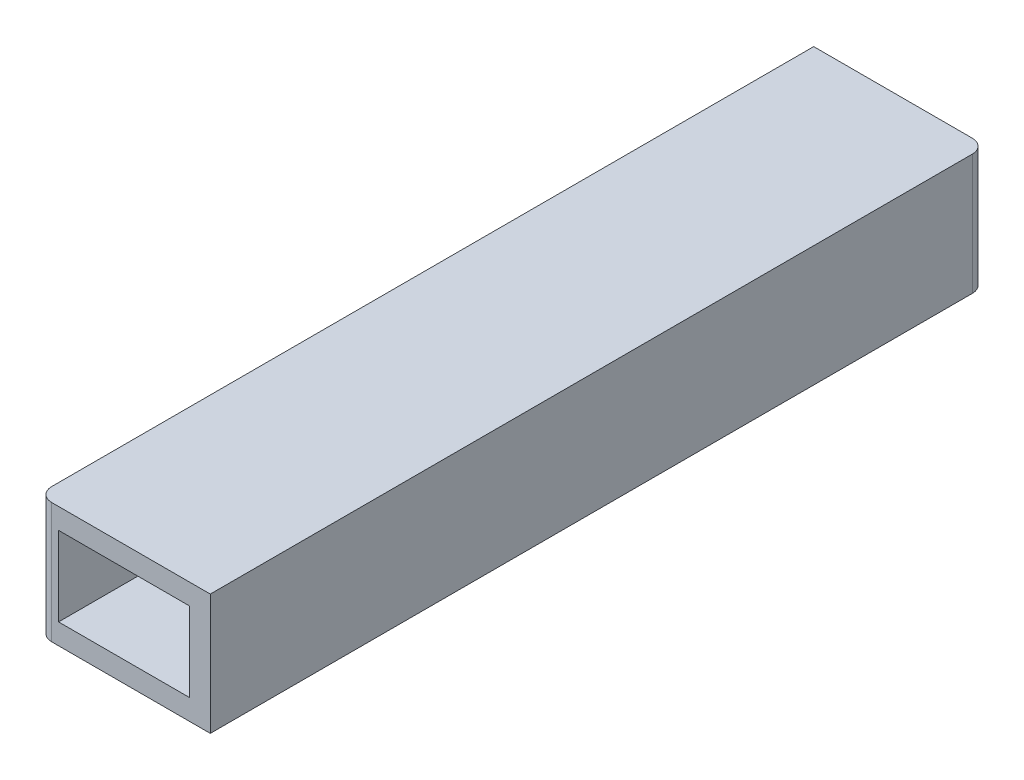
ISO-10303-21;
HEADER;
FILE_DESCRIPTION(('STEP AP214'),'2;1');
FILE_NAME('part.step','',(''),(''),'','','');
FILE_SCHEMA(('AUTOMOTIVE_DESIGN { 1 0 10303 214 1 1 1 1 }'));
ENDSEC;
DATA;
#1=APPLICATION_CONTEXT('core data for automotive mechanical design processes');
#2=APPLICATION_PROTOCOL_DEFINITION('international standard','automotive_design',2000,#1);
#3=PRODUCT_CONTEXT('',#1,'mechanical');
#4=PRODUCT('Part','Part','',(#3));
#5=PRODUCT_RELATED_PRODUCT_CATEGORY('part','',(#4));
#6=PRODUCT_DEFINITION_FORMATION('','',#4);
#7=PRODUCT_DEFINITION_CONTEXT('part definition',#1,'design');
#8=PRODUCT_DEFINITION('design','',#6,#7);
#9=PRODUCT_DEFINITION_SHAPE('','',#8);
#10=(LENGTH_UNIT() NAMED_UNIT(*) SI_UNIT(.MILLI.,.METRE.));
#11=(NAMED_UNIT(*) PLANE_ANGLE_UNIT() SI_UNIT($,.RADIAN.));
#12=(NAMED_UNIT(*) SI_UNIT($,.STERADIAN.) SOLID_ANGLE_UNIT());
#13=UNCERTAINTY_MEASURE_WITH_UNIT(LENGTH_MEASURE(1.E-05),#10,'distance_accuracy_value','');
#14=(GEOMETRIC_REPRESENTATION_CONTEXT(3) GLOBAL_UNCERTAINTY_ASSIGNED_CONTEXT((#13)) GLOBAL_UNIT_ASSIGNED_CONTEXT((#10,
#11,#12)) REPRESENTATION_CONTEXT('',''));
#15=CARTESIAN_POINT('',(0.,0.,0.));
#16=DIRECTION('',(0.,0.,1.));
#17=DIRECTION('',(1.,0.,0.));
#18=AXIS2_PLACEMENT_3D('',#15,#16,#17);
#19=CARTESIAN_POINT('',(-50.,35.,450.));
#20=DIRECTION('',(1.,0.,0.));
#21=DIRECTION('',(0.,0.,-1.));
#22=AXIS2_PLACEMENT_3D('',#19,#20,#21);
#23=PLANE('',#22);
#24=DIRECTION('',(0.,0.,-1.));
#25=VECTOR('',#24,1.);
#26=CARTESIAN_POINT('',(-50.,-35.,450.));
#27=LINE('',#26,#25);
#28=CARTESIAN_POINT('',(-50.,-35.,442.));
#29=VERTEX_POINT('',#28);
#30=CARTESIAN_POINT('',(-50.,-35.,0.));
#31=VERTEX_POINT('',#30);
#32=EDGE_CURVE('E181',#29,#31,#27,.T.);
#33=ORIENTED_EDGE('',*,*,#32,.F.);
#34=DIRECTION('',(0.,-1.,0.));
#35=VECTOR('',#34,1.);
#36=CARTESIAN_POINT('',(-50.,35.,442.));
#37=LINE('',#36,#35);
#38=CARTESIAN_POINT('',(-50.,35.,442.));
#39=VERTEX_POINT('',#38);
#40=EDGE_CURVE('E47',#29,#39,#37,.F.);
#41=ORIENTED_EDGE('',*,*,#40,.T.);
#42=DIRECTION('',(0.,0.,-1.));
#43=VECTOR('',#42,1.);
#44=CARTESIAN_POINT('',(-50.,35.,450.));
#45=LINE('',#44,#43);
#46=CARTESIAN_POINT('',(-50.,35.,0.));
#47=VERTEX_POINT('',#46);
#48=EDGE_CURVE('E166',#39,#47,#45,.T.);
#49=ORIENTED_EDGE('',*,*,#48,.T.);
#50=DIRECTION('',(0.,-1.,0.));
#51=VECTOR('',#50,1.);
#52=CARTESIAN_POINT('',(-50.,35.,0.));
#53=LINE('',#52,#51);
#54=EDGE_CURVE('E154',#47,#31,#53,.T.);
#55=ORIENTED_EDGE('',*,*,#54,.T.);
#56=EDGE_LOOP('',(#33,#41,#49,#55));
#57=FACE_BOUND('',#56,.T.);
#58=ADVANCED_FACE('F39',(#57),#23,.F.);
#59=CARTESIAN_POINT('',(-50.,-35.,450.));
#60=DIRECTION('',(0.,1.,0.));
#61=DIRECTION('',(0.,0.,1.));
#62=AXIS2_PLACEMENT_3D('',#59,#60,#61);
#63=PLANE('',#62);
#64=DIRECTION('',(1.,0.,0.));
#65=VECTOR('',#64,1.);
#66=CARTESIAN_POINT('',(-50.,-35.,450.));
#67=LINE('',#66,#65);
#68=CARTESIAN_POINT('',(-42.,-35.,450.));
#69=VERTEX_POINT('',#68);
#70=CARTESIAN_POINT('',(50.,-35.,450.));
#71=VERTEX_POINT('',#70);
#72=EDGE_CURVE('E158',#69,#71,#67,.T.);
#73=ORIENTED_EDGE('',*,*,#72,.F.);
#74=CARTESIAN_POINT('',(-42.,-35.,442.));
#75=DIRECTION('',(0.,1.,0.));
#76=DIRECTION('',(0.,0.,1.));
#77=AXIS2_PLACEMENT_3D('',#74,#75,#76);
#78=CIRCLE('',#77,8.);
#79=EDGE_CURVE('E61',#69,#29,#78,.F.);
#80=ORIENTED_EDGE('',*,*,#79,.T.);
#81=ORIENTED_EDGE('',*,*,#32,.T.);
#82=DIRECTION('',(1.,0.,0.));
#83=VECTOR('',#82,1.);
#84=CARTESIAN_POINT('',(-50.,-35.,0.));
#85=LINE('',#84,#83);
#86=CARTESIAN_POINT('',(42.,-35.,0.));
#87=VERTEX_POINT('',#86);
#88=EDGE_CURVE('E169',#31,#87,#85,.T.);
#89=ORIENTED_EDGE('',*,*,#88,.T.);
#90=CARTESIAN_POINT('',(42.,-35.,8.00000000000001));
#91=DIRECTION('',(0.,1.,0.));
#92=DIRECTION('',(0.,0.,1.));
#93=AXIS2_PLACEMENT_3D('',#90,#91,#92);
#94=CIRCLE('',#93,8.);
#95=CARTESIAN_POINT('',(50.,-35.,8.00000000000001));
#96=VERTEX_POINT('',#95);
#97=EDGE_CURVE('E190',#87,#96,#94,.F.);
#98=ORIENTED_EDGE('',*,*,#97,.T.);
#99=DIRECTION('',(0.,0.,-1.));
#100=VECTOR('',#99,1.);
#101=CARTESIAN_POINT('',(50.,-35.,450.));
#102=LINE('',#101,#100);
#103=EDGE_CURVE('E178',#71,#96,#102,.T.);
#104=ORIENTED_EDGE('',*,*,#103,.F.);
#105=EDGE_LOOP('',(#73,#80,#81,#89,#98,#104));
#106=FACE_BOUND('',#105,.T.);
#107=ADVANCED_FACE('F200',(#106),#63,.F.);
#108=CARTESIAN_POINT('',(50.,35.,450.));
#109=DIRECTION('',(-1.,0.,0.));
#110=DIRECTION('',(0.,0.,1.));
#111=AXIS2_PLACEMENT_3D('',#108,#109,#110);
#112=PLANE('',#111);
#113=ORIENTED_EDGE('',*,*,#103,.T.);
#114=DIRECTION('',(0.,1.,0.));
#115=VECTOR('',#114,1.);
#116=CARTESIAN_POINT('',(50.,35.,8.00000000000001));
#117=LINE('',#116,#115);
#118=CARTESIAN_POINT('',(50.,35.,8.00000000000001));
#119=VERTEX_POINT('',#118);
#120=EDGE_CURVE('E183',#96,#119,#117,.T.);
#121=ORIENTED_EDGE('',*,*,#120,.T.);
#122=DIRECTION('',(0.,0.,-1.));
#123=VECTOR('',#122,1.);
#124=CARTESIAN_POINT('',(50.,35.,450.));
#125=LINE('',#124,#123);
#126=CARTESIAN_POINT('',(50.,35.,450.));
#127=VERTEX_POINT('',#126);
#128=EDGE_CURVE('E175',#127,#119,#125,.T.);
#129=ORIENTED_EDGE('',*,*,#128,.F.);
#130=DIRECTION('',(0.,1.,0.));
#131=VECTOR('',#130,1.);
#132=CARTESIAN_POINT('',(50.,35.,450.));
#133=LINE('',#132,#131);
#134=EDGE_CURVE('E160',#71,#127,#133,.T.);
#135=ORIENTED_EDGE('',*,*,#134,.F.);
#136=EDGE_LOOP('',(#113,#121,#129,#135));
#137=FACE_BOUND('',#136,.T.);
#138=ADVANCED_FACE('F206',(#137),#112,.F.);
#139=CARTESIAN_POINT('',(-50.,35.,450.));
#140=DIRECTION('',(0.,-1.,0.));
#141=DIRECTION('',(0.,0.,-1.));
#142=AXIS2_PLACEMENT_3D('',#139,#140,#141);
#143=PLANE('',#142);
#144=ORIENTED_EDGE('',*,*,#48,.F.);
#145=CARTESIAN_POINT('',(-42.,35.,442.));
#146=DIRECTION('',(0.,-1.,0.));
#147=DIRECTION('',(0.,0.,-1.));
#148=AXIS2_PLACEMENT_3D('',#145,#146,#147);
#149=CIRCLE('',#148,8.);
#150=CARTESIAN_POINT('',(-42.,35.,450.));
#151=VERTEX_POINT('',#150);
#152=EDGE_CURVE('E11',#39,#151,#149,.F.);
#153=ORIENTED_EDGE('',*,*,#152,.T.);
#154=DIRECTION('',(-1.,0.,0.));
#155=VECTOR('',#154,1.);
#156=CARTESIAN_POINT('',(-50.,35.,450.));
#157=LINE('',#156,#155);
#158=EDGE_CURVE('E163',#127,#151,#157,.T.);
#159=ORIENTED_EDGE('',*,*,#158,.F.);
#160=ORIENTED_EDGE('',*,*,#128,.T.);
#161=CARTESIAN_POINT('',(42.,35.,8.00000000000001));
#162=DIRECTION('',(0.,-1.,0.));
#163=DIRECTION('',(0.,0.,-1.));
#164=AXIS2_PLACEMENT_3D('',#161,#162,#163);
#165=CIRCLE('',#164,8.);
#166=CARTESIAN_POINT('',(42.,35.,0.));
#167=VERTEX_POINT('',#166);
#168=EDGE_CURVE('E186',#119,#167,#165,.F.);
#169=ORIENTED_EDGE('',*,*,#168,.T.);
#170=DIRECTION('',(-1.,0.,0.));
#171=VECTOR('',#170,1.);
#172=CARTESIAN_POINT('',(-50.,35.,0.));
#173=LINE('',#172,#171);
#174=EDGE_CURVE('E161',#167,#47,#173,.T.);
#175=ORIENTED_EDGE('',*,*,#174,.T.);
#176=EDGE_LOOP('',(#144,#153,#159,#160,#169,#175));
#177=FACE_BOUND('',#176,.T.);
#178=ADVANCED_FACE('F208',(#177),#143,.F.);
#179=CARTESIAN_POINT('',(0.,0.,450.));
#180=DIRECTION('',(0.,0.,1.));
#181=DIRECTION('',(1.,0.,0.));
#182=AXIS2_PLACEMENT_3D('',#179,#180,#181);
#183=PLANE('',#182);
#184=DIRECTION('',(0.,-1.,0.));
#185=VECTOR('',#184,1.);
#186=CARTESIAN_POINT('',(-38.,23.,450.));
#187=LINE('',#186,#185);
#188=CARTESIAN_POINT('',(-38.,23.,450.));
#189=VERTEX_POINT('',#188);
#190=CARTESIAN_POINT('',(-38.,-23.,450.));
#191=VERTEX_POINT('',#190);
#192=EDGE_CURVE('E134',#189,#191,#187,.T.);
#193=ORIENTED_EDGE('',*,*,#192,.F.);
#194=DIRECTION('',(-1.,0.,0.));
#195=VECTOR('',#194,1.);
#196=CARTESIAN_POINT('',(-38.,23.,450.));
#197=LINE('',#196,#195);
#198=CARTESIAN_POINT('',(38.,23.,450.));
#199=VERTEX_POINT('',#198);
#200=EDGE_CURVE('E139',#199,#189,#197,.T.);
#201=ORIENTED_EDGE('',*,*,#200,.F.);
#202=DIRECTION('',(0.,1.,0.));
#203=VECTOR('',#202,1.);
#204=CARTESIAN_POINT('',(38.,23.,450.));
#205=LINE('',#204,#203);
#206=CARTESIAN_POINT('',(38.,-23.,450.));
#207=VERTEX_POINT('',#206);
#208=EDGE_CURVE('E118',#207,#199,#205,.T.);
#209=ORIENTED_EDGE('',*,*,#208,.F.);
#210=DIRECTION('',(1.,0.,0.));
#211=VECTOR('',#210,1.);
#212=CARTESIAN_POINT('',(-38.,-23.,450.));
#213=LINE('',#212,#211);
#214=EDGE_CURVE('E129',#191,#207,#213,.T.);
#215=ORIENTED_EDGE('',*,*,#214,.F.);
#216=EDGE_LOOP('',(#193,#201,#209,#215));
#217=FACE_BOUND('',#216,.T.);
#218=ORIENTED_EDGE('',*,*,#158,.T.);
#219=DIRECTION('',(0.,-1.,0.));
#220=VECTOR('',#219,1.);
#221=CARTESIAN_POINT('',(-42.,-35.,450.));
#222=LINE('',#221,#220);
#223=EDGE_CURVE('E192',#151,#69,#222,.T.);
#224=ORIENTED_EDGE('',*,*,#223,.T.);
#225=ORIENTED_EDGE('',*,*,#72,.T.);
#226=ORIENTED_EDGE('',*,*,#134,.T.);
#227=EDGE_LOOP('',(#218,#224,#225,#226));
#228=FACE_BOUND('',#227,.T.);
#229=ADVANCED_FACE('F136',(#217,#228),#183,.T.);
#230=CARTESIAN_POINT('',(0.,0.,0.));
#231=DIRECTION('',(0.,0.,1.));
#232=DIRECTION('',(1.,0.,0.));
#233=AXIS2_PLACEMENT_3D('',#230,#231,#232);
#234=PLANE('',#233);
#235=DIRECTION('',(-1.,0.,0.));
#236=VECTOR('',#235,1.);
#237=CARTESIAN_POINT('',(38.,-23.,0.));
#238=LINE('',#237,#236);
#239=CARTESIAN_POINT('',(38.,-23.,0.));
#240=VERTEX_POINT('',#239);
#241=CARTESIAN_POINT('',(-38.,-23.,0.));
#242=VERTEX_POINT('',#241);
#243=EDGE_CURVE('E145',#240,#242,#238,.T.);
#244=ORIENTED_EDGE('',*,*,#243,.F.);
#245=DIRECTION('',(0.,-1.,0.));
#246=VECTOR('',#245,1.);
#247=CARTESIAN_POINT('',(38.,23.,0.));
#248=LINE('',#247,#246);
#249=CARTESIAN_POINT('',(38.,23.,0.));
#250=VERTEX_POINT('',#249);
#251=EDGE_CURVE('E121',#250,#240,#248,.T.);
#252=ORIENTED_EDGE('',*,*,#251,.F.);
#253=DIRECTION('',(1.,0.,0.));
#254=VECTOR('',#253,1.);
#255=CARTESIAN_POINT('',(38.,23.,0.));
#256=LINE('',#255,#254);
#257=CARTESIAN_POINT('',(-38.,23.,0.));
#258=VERTEX_POINT('',#257);
#259=EDGE_CURVE('E126',#258,#250,#256,.T.);
#260=ORIENTED_EDGE('',*,*,#259,.F.);
#261=DIRECTION('',(0.,1.,0.));
#262=VECTOR('',#261,1.);
#263=CARTESIAN_POINT('',(-38.,23.,0.));
#264=LINE('',#263,#262);
#265=EDGE_CURVE('E147',#242,#258,#264,.T.);
#266=ORIENTED_EDGE('',*,*,#265,.F.);
#267=EDGE_LOOP('',(#244,#252,#260,#266));
#268=FACE_BOUND('',#267,.T.);
#269=ORIENTED_EDGE('',*,*,#174,.F.);
#270=DIRECTION('',(0.,1.,0.));
#271=VECTOR('',#270,1.);
#272=CARTESIAN_POINT('',(42.,0.,0.));
#273=LINE('',#272,#271);
#274=EDGE_CURVE('E188',#167,#87,#273,.F.);
#275=ORIENTED_EDGE('',*,*,#274,.T.);
#276=ORIENTED_EDGE('',*,*,#88,.F.);
#277=ORIENTED_EDGE('',*,*,#54,.F.);
#278=EDGE_LOOP('',(#269,#275,#276,#277));
#279=FACE_BOUND('',#278,.T.);
#280=ADVANCED_FACE('F227',(#268,#279),#234,.F.);
#281=CARTESIAN_POINT('',(38.,23.,420.));
#282=DIRECTION('',(1.,0.,0.));
#283=DIRECTION('',(0.,0.,-1.));
#284=AXIS2_PLACEMENT_3D('',#281,#282,#283);
#285=PLANE('',#284);
#286=ORIENTED_EDGE('',*,*,#251,.T.);
#287=DIRECTION('',(0.,0.,-1.));
#288=VECTOR('',#287,1.);
#289=CARTESIAN_POINT('',(38.,-23.,420.));
#290=LINE('',#289,#288);
#291=EDGE_CURVE('E114',#207,#240,#290,.T.);
#292=ORIENTED_EDGE('',*,*,#291,.F.);
#293=ORIENTED_EDGE('',*,*,#208,.T.);
#294=DIRECTION('',(0.,0.,-1.));
#295=VECTOR('',#294,1.);
#296=CARTESIAN_POINT('',(38.,23.,420.));
#297=LINE('',#296,#295);
#298=EDGE_CURVE('E152',#199,#250,#297,.T.);
#299=ORIENTED_EDGE('',*,*,#298,.T.);
#300=EDGE_LOOP('',(#286,#292,#293,#299));
#301=FACE_BOUND('',#300,.T.);
#302=ADVANCED_FACE('F116',(#301),#285,.F.);
#303=CARTESIAN_POINT('',(38.,23.,420.));
#304=DIRECTION('',(0.,1.,0.));
#305=DIRECTION('',(0.,0.,1.));
#306=AXIS2_PLACEMENT_3D('',#303,#304,#305);
#307=PLANE('',#306);
#308=ORIENTED_EDGE('',*,*,#259,.T.);
#309=ORIENTED_EDGE('',*,*,#298,.F.);
#310=ORIENTED_EDGE('',*,*,#200,.T.);
#311=DIRECTION('',(0.,0.,-1.));
#312=VECTOR('',#311,1.);
#313=CARTESIAN_POINT('',(-38.,23.,420.));
#314=LINE('',#313,#312);
#315=EDGE_CURVE('E155',#189,#258,#314,.T.);
#316=ORIENTED_EDGE('',*,*,#315,.T.);
#317=EDGE_LOOP('',(#308,#309,#310,#316));
#318=FACE_BOUND('',#317,.T.);
#319=ADVANCED_FACE('F234',(#318),#307,.F.);
#320=CARTESIAN_POINT('',(-38.,23.,420.));
#321=DIRECTION('',(-1.,0.,0.));
#322=DIRECTION('',(0.,0.,1.));
#323=AXIS2_PLACEMENT_3D('',#320,#321,#322);
#324=PLANE('',#323);
#325=ORIENTED_EDGE('',*,*,#265,.T.);
#326=ORIENTED_EDGE('',*,*,#315,.F.);
#327=ORIENTED_EDGE('',*,*,#192,.T.);
#328=DIRECTION('',(0.,0.,-1.));
#329=VECTOR('',#328,1.);
#330=CARTESIAN_POINT('',(-38.,-23.,420.));
#331=LINE('',#330,#329);
#332=EDGE_CURVE('E125',#191,#242,#331,.T.);
#333=ORIENTED_EDGE('',*,*,#332,.T.);
#334=EDGE_LOOP('',(#325,#326,#327,#333));
#335=FACE_BOUND('',#334,.T.);
#336=ADVANCED_FACE('F237',(#335),#324,.F.);
#337=CARTESIAN_POINT('',(38.,-23.,420.));
#338=DIRECTION('',(0.,-1.,0.));
#339=DIRECTION('',(0.,0.,-1.));
#340=AXIS2_PLACEMENT_3D('',#337,#338,#339);
#341=PLANE('',#340);
#342=ORIENTED_EDGE('',*,*,#243,.T.);
#343=ORIENTED_EDGE('',*,*,#332,.F.);
#344=ORIENTED_EDGE('',*,*,#214,.T.);
#345=ORIENTED_EDGE('',*,*,#291,.T.);
#346=EDGE_LOOP('',(#342,#343,#344,#345));
#347=FACE_BOUND('',#346,.T.);
#348=ADVANCED_FACE('F130',(#347),#341,.F.);
#349=CARTESIAN_POINT('',(42.,35.,8.00000000000001));
#350=DIRECTION('',(0.,1.,0.));
#351=DIRECTION('',(0.,0.,1.));
#352=AXIS2_PLACEMENT_3D('',#349,#350,#351);
#353=CYLINDRICAL_SURFACE('',#352,8.);
#354=ORIENTED_EDGE('',*,*,#97,.F.);
#355=ORIENTED_EDGE('',*,*,#274,.F.);
#356=ORIENTED_EDGE('',*,*,#168,.F.);
#357=ORIENTED_EDGE('',*,*,#120,.F.);
#358=EDGE_LOOP('',(#354,#355,#356,#357));
#359=FACE_BOUND('',#358,.T.);
#360=ADVANCED_FACE('F210',(#359),#353,.T.);
#361=CARTESIAN_POINT('',(-42.,0.,442.));
#362=DIRECTION('',(0.,1.,0.));
#363=DIRECTION('',(0.,0.,1.));
#364=AXIS2_PLACEMENT_3D('',#361,#362,#363);
#365=CYLINDRICAL_SURFACE('',#364,8.);
#366=ORIENTED_EDGE('',*,*,#152,.F.);
#367=ORIENTED_EDGE('',*,*,#40,.F.);
#368=ORIENTED_EDGE('',*,*,#79,.F.);
#369=ORIENTED_EDGE('',*,*,#223,.F.);
#370=EDGE_LOOP('',(#366,#367,#368,#369));
#371=FACE_BOUND('',#370,.T.);
#372=ADVANCED_FACE('F41',(#371),#365,.T.);
#373=CLOSED_SHELL('',(#58,#107,#138,#178,#229,#280,#302,#319,#336,#348,#360,#372));
#374=MANIFOLD_SOLID_BREP('B2',#373);
#375=ADVANCED_BREP_SHAPE_REPRESENTATION('',(#18,#374),#14);
#376=SHAPE_DEFINITION_REPRESENTATION(#9,#375);
ENDSEC;
END-ISO-10303-21;
